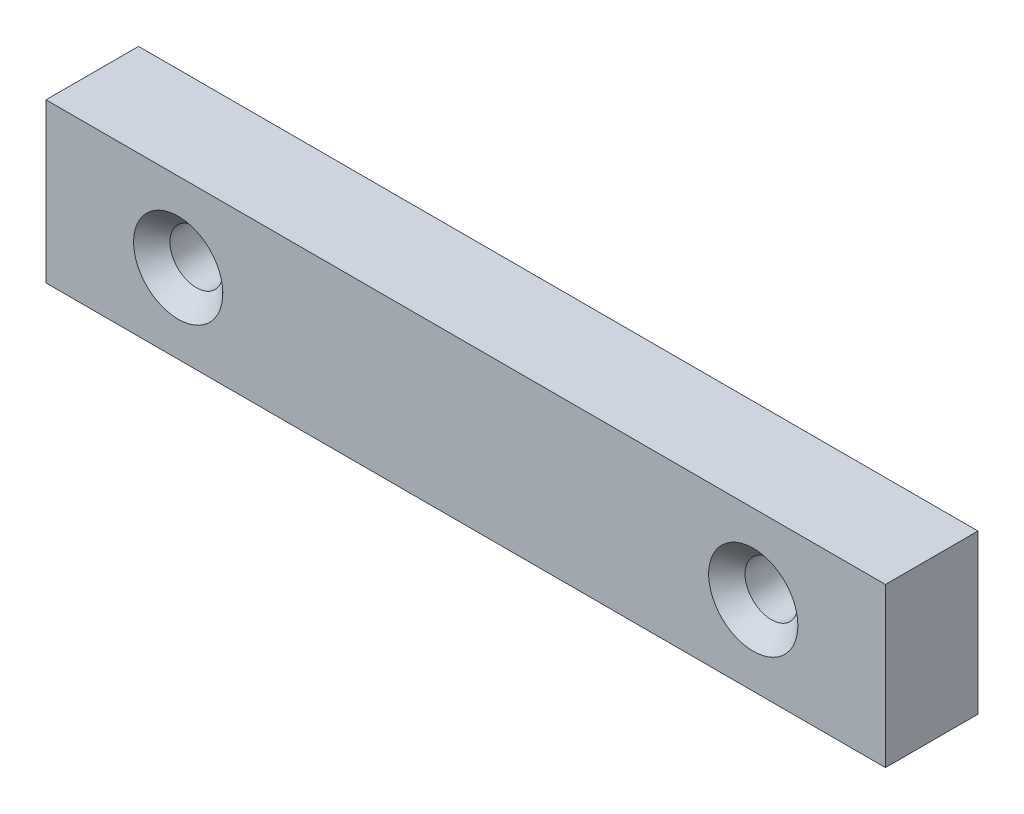
ISO-10303-21;
HEADER;
FILE_DESCRIPTION(('STEP AP214'),'2;1');
FILE_NAME('part.step','',(''),(''),'','','');
FILE_SCHEMA(('AUTOMOTIVE_DESIGN { 1 0 10303 214 1 1 1 1 }'));
ENDSEC;
DATA;
#1=APPLICATION_CONTEXT('core data for automotive mechanical design processes');
#2=APPLICATION_PROTOCOL_DEFINITION('international standard','automotive_design',2000,#1);
#3=PRODUCT_CONTEXT('',#1,'mechanical');
#4=PRODUCT('Part','Part','',(#3));
#5=PRODUCT_RELATED_PRODUCT_CATEGORY('part','',(#4));
#6=PRODUCT_DEFINITION_FORMATION('','',#4);
#7=PRODUCT_DEFINITION_CONTEXT('part definition',#1,'design');
#8=PRODUCT_DEFINITION('design','',#6,#7);
#9=PRODUCT_DEFINITION_SHAPE('','',#8);
#10=(LENGTH_UNIT() NAMED_UNIT(*) SI_UNIT(.MILLI.,.METRE.));
#11=(NAMED_UNIT(*) PLANE_ANGLE_UNIT() SI_UNIT($,.RADIAN.));
#12=(NAMED_UNIT(*) SI_UNIT($,.STERADIAN.) SOLID_ANGLE_UNIT());
#13=UNCERTAINTY_MEASURE_WITH_UNIT(LENGTH_MEASURE(1.E-05),#10,'distance_accuracy_value','');
#14=(GEOMETRIC_REPRESENTATION_CONTEXT(3) GLOBAL_UNCERTAINTY_ASSIGNED_CONTEXT((#13)) GLOBAL_UNIT_ASSIGNED_CONTEXT((#10,
#11,#12)) REPRESENTATION_CONTEXT('',''));
#15=CARTESIAN_POINT('',(0.,0.,0.));
#16=DIRECTION('',(0.,0.,1.));
#17=DIRECTION('',(1.,0.,0.));
#18=AXIS2_PLACEMENT_3D('',#15,#16,#17);
#19=CARTESIAN_POINT('',(0.,0.,7.));
#20=DIRECTION('',(0.,0.,1.));
#21=DIRECTION('',(1.,0.,0.));
#22=AXIS2_PLACEMENT_3D('',#19,#20,#21);
#23=PLANE('',#22);
#24=CARTESIAN_POINT('',(43.5,0.,7.000000000005));
#25=DIRECTION('',(0.,0.,1.));
#26=DIRECTION('',(1.,0.,0.));
#27=AXIS2_PLACEMENT_3D('',#24,#25,#26);
#28=CIRCLE('',#27,6.7500000000623);
#29=CARTESIAN_POINT('',(50.2500000000623,0.,7.000000000005));
#30=VERTEX_POINT('',#29);
#31=EDGE_CURVE('E69',#30,#30,#28,.F.);
#32=ORIENTED_EDGE('',*,*,#31,.T.);
#33=EDGE_LOOP('',(#32));
#34=FACE_BOUND('',#33,.T.);
#35=CARTESIAN_POINT('',(-43.5,0.,6.99999999994816));
#36=DIRECTION('',(0.,0.,1.));
#37=DIRECTION('',(0.,-1.,0.));
#38=AXIS2_PLACEMENT_3D('',#35,#36,#37);
#39=CIRCLE('',#38,6.75000000007322);
#40=CARTESIAN_POINT('',(-43.5,-6.75000000007322,6.99999999994816));
#41=VERTEX_POINT('',#40);
#42=EDGE_CURVE('E20',#41,#41,#39,.F.);
#43=ORIENTED_EDGE('',*,*,#42,.T.);
#44=EDGE_LOOP('',(#43));
#45=FACE_BOUND('',#44,.T.);
#46=DIRECTION('',(1.,0.,0.));
#47=VECTOR('',#46,1.);
#48=CARTESIAN_POINT('',(-63.5,-12.,7.));
#49=LINE('',#48,#47);
#50=CARTESIAN_POINT('',(63.5,-12.,7.));
#51=VERTEX_POINT('',#50);
#52=CARTESIAN_POINT('',(-63.5,-12.,7.));
#53=VERTEX_POINT('',#52);
#54=EDGE_CURVE('E71',#51,#53,#49,.F.);
#55=ORIENTED_EDGE('',*,*,#54,.F.);
#56=DIRECTION('',(0.,1.,0.));
#57=VECTOR('',#56,1.);
#58=CARTESIAN_POINT('',(63.5,-12.,7.));
#59=LINE('',#58,#57);
#60=CARTESIAN_POINT('',(63.5,12.,7.));
#61=VERTEX_POINT('',#60);
#62=EDGE_CURVE('E55',#61,#51,#59,.F.);
#63=ORIENTED_EDGE('',*,*,#62,.F.);
#64=DIRECTION('',(-1.,0.,0.));
#65=VECTOR('',#64,1.);
#66=CARTESIAN_POINT('',(63.5,12.,7.));
#67=LINE('',#66,#65);
#68=CARTESIAN_POINT('',(-63.5,12.,7.));
#69=VERTEX_POINT('',#68);
#70=EDGE_CURVE('E60',#69,#61,#67,.F.);
#71=ORIENTED_EDGE('',*,*,#70,.F.);
#72=DIRECTION('',(0.,-1.,0.));
#73=VECTOR('',#72,1.);
#74=CARTESIAN_POINT('',(-63.5,12.,7.));
#75=LINE('',#74,#73);
#76=EDGE_CURVE('E231',#53,#69,#75,.F.);
#77=ORIENTED_EDGE('',*,*,#76,.F.);
#78=EDGE_LOOP('',(#55,#63,#71,#77));
#79=FACE_BOUND('',#78,.T.);
#80=ADVANCED_FACE('F17',(#34,#45,#79),#23,.T.);
#81=CARTESIAN_POINT('',(-43.5,0.,6.99999999994816));
#82=DIRECTION('',(0.,0.,1.));
#83=DIRECTION('',(0.,-1.,0.));
#84=AXIS2_PLACEMENT_3D('',#81,#82,#83);
#85=CONICAL_SURFACE('',#84,6.75000000007322,0.785398163407783);
#86=CARTESIAN_POINT('',(-43.5,0.,4.25));
#87=DIRECTION('',(0.,0.,1.));
#88=DIRECTION('',(1.,0.,0.));
#89=AXIS2_PLACEMENT_3D('',#86,#87,#88);
#90=CIRCLE('',#89,4.);
#91=CARTESIAN_POINT('',(-39.5,0.,4.25));
#92=VERTEX_POINT('',#91);
#93=EDGE_CURVE('E232',#92,#92,#90,.F.);
#94=ORIENTED_EDGE('',*,*,#93,.T.);
#95=EDGE_LOOP('',(#94));
#96=FACE_BOUND('',#95,.T.);
#97=ORIENTED_EDGE('',*,*,#42,.F.);
#98=EDGE_LOOP('',(#97));
#99=FACE_BOUND('',#98,.T.);
#100=ADVANCED_FACE('F91',(#96,#99),#85,.F.);
#101=CARTESIAN_POINT('',(43.5,0.,7.000000000005));
#102=DIRECTION('',(0.,0.,1.));
#103=DIRECTION('',(1.,0.,0.));
#104=AXIS2_PLACEMENT_3D('',#101,#102,#103);
#105=CONICAL_SURFACE('',#104,6.7500000000623,0.785398163397448);
#106=CARTESIAN_POINT('',(43.5,0.,4.25));
#107=DIRECTION('',(0.,0.,1.));
#108=DIRECTION('',(1.,0.,0.));
#109=AXIS2_PLACEMENT_3D('',#106,#107,#108);
#110=CIRCLE('',#109,4.);
#111=CARTESIAN_POINT('',(47.5,0.,4.25));
#112=VERTEX_POINT('',#111);
#113=EDGE_CURVE('E242',#112,#112,#110,.F.);
#114=ORIENTED_EDGE('',*,*,#113,.T.);
#115=EDGE_LOOP('',(#114));
#116=FACE_BOUND('',#115,.T.);
#117=ORIENTED_EDGE('',*,*,#31,.F.);
#118=EDGE_LOOP('',(#117));
#119=FACE_BOUND('',#118,.T.);
#120=ADVANCED_FACE('F93',(#116,#119),#105,.F.);
#121=CARTESIAN_POINT('',(63.5,12.,0.));
#122=DIRECTION('',(0.,1.,0.));
#123=DIRECTION('',(-1.,0.,0.));
#124=AXIS2_PLACEMENT_3D('',#121,#122,#123);
#125=PLANE('',#124);
#126=DIRECTION('',(0.,0.,-1.));
#127=VECTOR('',#126,1.);
#128=CARTESIAN_POINT('',(63.5,12.,0.));
#129=LINE('',#128,#127);
#130=CARTESIAN_POINT('',(63.5,12.,-7.));
#131=VERTEX_POINT('',#130);
#132=EDGE_CURVE('E62',#131,#61,#129,.F.);
#133=ORIENTED_EDGE('',*,*,#132,.F.);
#134=DIRECTION('',(-1.,0.,0.));
#135=VECTOR('',#134,1.);
#136=CARTESIAN_POINT('',(0.,12.,-7.));
#137=LINE('',#136,#135);
#138=CARTESIAN_POINT('',(-63.5,12.,-7.));
#139=VERTEX_POINT('',#138);
#140=EDGE_CURVE('E235',#139,#131,#137,.F.);
#141=ORIENTED_EDGE('',*,*,#140,.F.);
#142=DIRECTION('',(0.,0.,1.));
#143=VECTOR('',#142,1.);
#144=CARTESIAN_POINT('',(-63.5,12.,0.));
#145=LINE('',#144,#143);
#146=EDGE_CURVE('E65',#69,#139,#145,.F.);
#147=ORIENTED_EDGE('',*,*,#146,.F.);
#148=ORIENTED_EDGE('',*,*,#70,.T.);
#149=EDGE_LOOP('',(#133,#141,#147,#148));
#150=FACE_BOUND('',#149,.T.);
#151=ADVANCED_FACE('F61',(#150),#125,.T.);
#152=CARTESIAN_POINT('',(63.5,-12.,0.));
#153=DIRECTION('',(1.,0.,0.));
#154=DIRECTION('',(0.,0.,-1.));
#155=AXIS2_PLACEMENT_3D('',#152,#153,#154);
#156=PLANE('',#155);
#157=DIRECTION('',(0.,0.,1.));
#158=VECTOR('',#157,1.);
#159=CARTESIAN_POINT('',(63.5,-12.,0.));
#160=LINE('',#159,#158);
#161=CARTESIAN_POINT('',(63.5,-12.,-7.));
#162=VERTEX_POINT('',#161);
#163=EDGE_CURVE('E73',#162,#51,#160,.T.);
#164=ORIENTED_EDGE('',*,*,#163,.F.);
#165=DIRECTION('',(0.,1.,0.));
#166=VECTOR('',#165,1.);
#167=CARTESIAN_POINT('',(63.5,0.,-7.));
#168=LINE('',#167,#166);
#169=EDGE_CURVE('E77',#131,#162,#168,.F.);
#170=ORIENTED_EDGE('',*,*,#169,.F.);
#171=ORIENTED_EDGE('',*,*,#132,.T.);
#172=ORIENTED_EDGE('',*,*,#62,.T.);
#173=EDGE_LOOP('',(#164,#170,#171,#172));
#174=FACE_BOUND('',#173,.T.);
#175=ADVANCED_FACE('F75',(#174),#156,.T.);
#176=CARTESIAN_POINT('',(-63.5,-12.,0.));
#177=DIRECTION('',(0.,-1.,0.));
#178=DIRECTION('',(1.,0.,0.));
#179=AXIS2_PLACEMENT_3D('',#176,#177,#178);
#180=PLANE('',#179);
#181=DIRECTION('',(0.,0.,1.));
#182=VECTOR('',#181,1.);
#183=CARTESIAN_POINT('',(-63.5,-12.,0.));
#184=LINE('',#183,#182);
#185=CARTESIAN_POINT('',(-63.5,-12.,-7.));
#186=VERTEX_POINT('',#185);
#187=EDGE_CURVE('E35',#186,#53,#184,.T.);
#188=ORIENTED_EDGE('',*,*,#187,.F.);
#189=DIRECTION('',(-1.,0.,0.));
#190=VECTOR('',#189,1.);
#191=CARTESIAN_POINT('',(0.,-12.,-7.));
#192=LINE('',#191,#190);
#193=EDGE_CURVE('E236',#162,#186,#192,.T.);
#194=ORIENTED_EDGE('',*,*,#193,.F.);
#195=ORIENTED_EDGE('',*,*,#163,.T.);
#196=ORIENTED_EDGE('',*,*,#54,.T.);
#197=EDGE_LOOP('',(#188,#194,#195,#196));
#198=FACE_BOUND('',#197,.T.);
#199=ADVANCED_FACE('F122',(#198),#180,.T.);
#200=CARTESIAN_POINT('',(-63.5,12.,0.));
#201=DIRECTION('',(-1.,0.,0.));
#202=DIRECTION('',(0.,-1.,0.));
#203=AXIS2_PLACEMENT_3D('',#200,#201,#202);
#204=PLANE('',#203);
#205=ORIENTED_EDGE('',*,*,#146,.T.);
#206=DIRECTION('',(0.,1.,0.));
#207=VECTOR('',#206,1.);
#208=CARTESIAN_POINT('',(-63.5,0.,-7.));
#209=LINE('',#208,#207);
#210=EDGE_CURVE('E83',#186,#139,#209,.T.);
#211=ORIENTED_EDGE('',*,*,#210,.F.);
#212=ORIENTED_EDGE('',*,*,#187,.T.);
#213=ORIENTED_EDGE('',*,*,#76,.T.);
#214=EDGE_LOOP('',(#205,#211,#212,#213));
#215=FACE_BOUND('',#214,.T.);
#216=ADVANCED_FACE('F118',(#215),#204,.T.);
#217=CARTESIAN_POINT('',(-43.5,0.,-123.003846096952));
#218=DIRECTION('',(0.,0.,1.));
#219=DIRECTION('',(1.,0.,0.));
#220=AXIS2_PLACEMENT_3D('',#217,#218,#219);
#221=CYLINDRICAL_SURFACE('',#220,4.);
#222=ORIENTED_EDGE('',*,*,#93,.F.);
#223=EDGE_LOOP('',(#222));
#224=FACE_BOUND('',#223,.T.);
#225=CARTESIAN_POINT('',(-43.5,0.,-6.99999999999999));
#226=DIRECTION('',(0.,0.,1.));
#227=DIRECTION('',(1.,0.,0.));
#228=AXIS2_PLACEMENT_3D('',#225,#226,#227);
#229=CIRCLE('',#228,4.);
#230=CARTESIAN_POINT('',(-39.5,0.,-6.99999999999999));
#231=VERTEX_POINT('',#230);
#232=EDGE_CURVE('E26',#231,#231,#229,.T.);
#233=ORIENTED_EDGE('',*,*,#232,.F.);
#234=EDGE_LOOP('',(#233));
#235=FACE_BOUND('',#234,.T.);
#236=ADVANCED_FACE('F111',(#224,#235),#221,.F.);
#237=CARTESIAN_POINT('',(43.5,0.,-123.003846096952));
#238=DIRECTION('',(0.,0.,1.));
#239=DIRECTION('',(1.,0.,0.));
#240=AXIS2_PLACEMENT_3D('',#237,#238,#239);
#241=CYLINDRICAL_SURFACE('',#240,4.);
#242=ORIENTED_EDGE('',*,*,#113,.F.);
#243=EDGE_LOOP('',(#242));
#244=FACE_BOUND('',#243,.T.);
#245=CARTESIAN_POINT('',(43.5,0.,-6.99999999999999));
#246=DIRECTION('',(0.,0.,1.));
#247=DIRECTION('',(1.,0.,0.));
#248=AXIS2_PLACEMENT_3D('',#245,#246,#247);
#249=CIRCLE('',#248,4.);
#250=CARTESIAN_POINT('',(47.5,0.,-6.99999999999999));
#251=VERTEX_POINT('',#250);
#252=EDGE_CURVE('E11',#251,#251,#249,.T.);
#253=ORIENTED_EDGE('',*,*,#252,.F.);
#254=EDGE_LOOP('',(#253));
#255=FACE_BOUND('',#254,.T.);
#256=ADVANCED_FACE('F105',(#244,#255),#241,.F.);
#257=CARTESIAN_POINT('',(0.,0.,-7.));
#258=DIRECTION('',(0.,0.,-1.));
#259=DIRECTION('',(-1.,0.,0.));
#260=AXIS2_PLACEMENT_3D('',#257,#258,#259);
#261=PLANE('',#260);
#262=ORIENTED_EDGE('',*,*,#252,.T.);
#263=EDGE_LOOP('',(#262));
#264=FACE_BOUND('',#263,.T.);
#265=ORIENTED_EDGE('',*,*,#232,.T.);
#266=EDGE_LOOP('',(#265));
#267=FACE_BOUND('',#266,.T.);
#268=ORIENTED_EDGE('',*,*,#193,.T.);
#269=ORIENTED_EDGE('',*,*,#210,.T.);
#270=ORIENTED_EDGE('',*,*,#140,.T.);
#271=ORIENTED_EDGE('',*,*,#169,.T.);
#272=EDGE_LOOP('',(#268,#269,#270,#271));
#273=FACE_BOUND('',#272,.T.);
#274=ADVANCED_FACE('F103',(#264,#267,#273),#261,.T.);
#275=CLOSED_SHELL('',(#80,#100,#120,#151,#175,#199,#216,#236,#256,#274));
#276=MANIFOLD_SOLID_BREP('B1',#275);
#277=ADVANCED_BREP_SHAPE_REPRESENTATION('',(#18,#276),#14);
#278=SHAPE_DEFINITION_REPRESENTATION(#9,#277);
ENDSEC;
END-ISO-10303-21;
